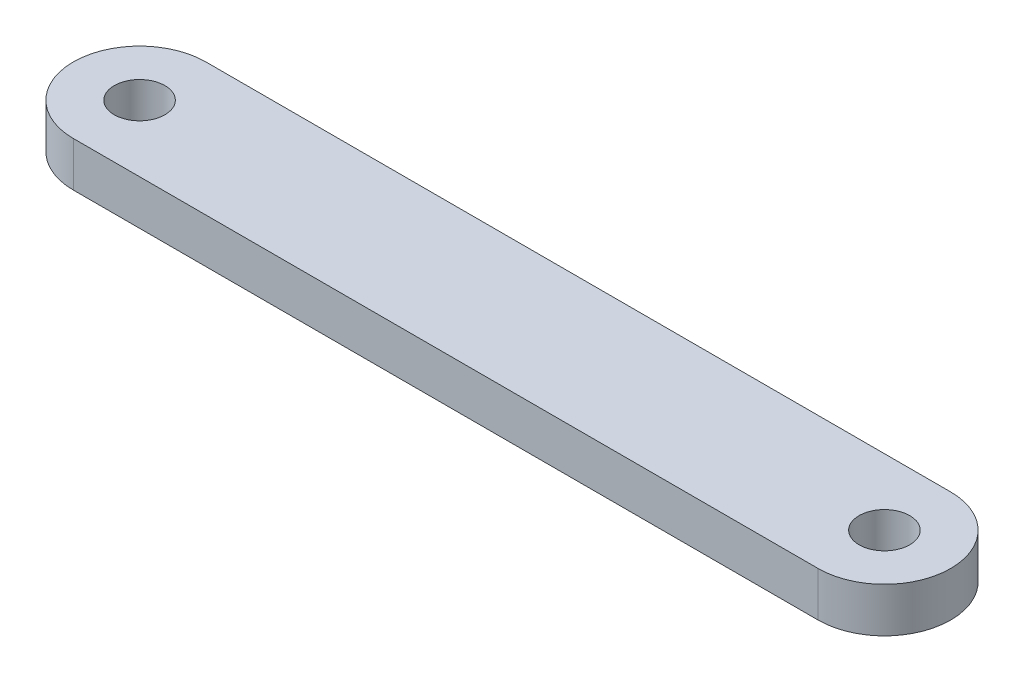
ISO-10303-21;
HEADER;
FILE_DESCRIPTION(('STEP AP214'),'2;1');
FILE_NAME('part.step','',(''),(''),'','','');
FILE_SCHEMA(('AUTOMOTIVE_DESIGN { 1 0 10303 214 1 1 1 1 }'));
ENDSEC;
DATA;
#1=APPLICATION_CONTEXT('core data for automotive mechanical design processes');
#2=APPLICATION_PROTOCOL_DEFINITION('international standard','automotive_design',2000,#1);
#3=PRODUCT_CONTEXT('',#1,'mechanical');
#4=PRODUCT('Part','Part','',(#3));
#5=PRODUCT_RELATED_PRODUCT_CATEGORY('part','',(#4));
#6=PRODUCT_DEFINITION_FORMATION('','',#4);
#7=PRODUCT_DEFINITION_CONTEXT('part definition',#1,'design');
#8=PRODUCT_DEFINITION('design','',#6,#7);
#9=PRODUCT_DEFINITION_SHAPE('','',#8);
#10=(LENGTH_UNIT() NAMED_UNIT(*) SI_UNIT(.MILLI.,.METRE.));
#11=(NAMED_UNIT(*) PLANE_ANGLE_UNIT() SI_UNIT($,.RADIAN.));
#12=(NAMED_UNIT(*) SI_UNIT($,.STERADIAN.) SOLID_ANGLE_UNIT());
#13=UNCERTAINTY_MEASURE_WITH_UNIT(LENGTH_MEASURE(1.E-05),#10,'distance_accuracy_value','');
#14=(GEOMETRIC_REPRESENTATION_CONTEXT(3) GLOBAL_UNCERTAINTY_ASSIGNED_CONTEXT((#13)) GLOBAL_UNIT_ASSIGNED_CONTEXT((#10,
#11,#12)) REPRESENTATION_CONTEXT('',''));
#15=CARTESIAN_POINT('',(0.,0.,0.));
#16=DIRECTION('',(0.,0.,1.));
#17=DIRECTION('',(1.,0.,0.));
#18=AXIS2_PLACEMENT_3D('',#15,#16,#17);
#19=CARTESIAN_POINT('',(0.,3.,4.45));
#20=DIRECTION('',(0.,0.,-1.));
#21=DIRECTION('',(-1.,0.,0.));
#22=AXIS2_PLACEMENT_3D('',#19,#20,#21);
#23=PLANE('',#22);
#24=DIRECTION('',(1.,0.,0.));
#25=VECTOR('',#24,1.);
#26=CARTESIAN_POINT('',(0.,0.,4.45));
#27=LINE('',#26,#25);
#28=CARTESIAN_POINT('',(0.,0.,4.45));
#29=VERTEX_POINT('',#28);
#30=CARTESIAN_POINT('',(50.,0.,4.45));
#31=VERTEX_POINT('',#30);
#32=EDGE_CURVE('E112',#29,#31,#27,.T.);
#33=ORIENTED_EDGE('',*,*,#32,.T.);
#34=DIRECTION('',(0.,-1.,0.));
#35=VECTOR('',#34,1.);
#36=CARTESIAN_POINT('',(50.,3.,4.45));
#37=LINE('',#36,#35);
#38=CARTESIAN_POINT('',(50.,3.,4.45));
#39=VERTEX_POINT('',#38);
#40=EDGE_CURVE('E11',#39,#31,#37,.T.);
#41=ORIENTED_EDGE('',*,*,#40,.F.);
#42=DIRECTION('',(1.,0.,0.));
#43=VECTOR('',#42,1.);
#44=CARTESIAN_POINT('',(0.,3.,4.45));
#45=LINE('',#44,#43);
#46=CARTESIAN_POINT('',(0.,3.,4.45));
#47=VERTEX_POINT('',#46);
#48=EDGE_CURVE('E93',#47,#39,#45,.T.);
#49=ORIENTED_EDGE('',*,*,#48,.F.);
#50=DIRECTION('',(0.,-1.,0.));
#51=VECTOR('',#50,1.);
#52=CARTESIAN_POINT('',(0.,3.,4.45));
#53=LINE('',#52,#51);
#54=EDGE_CURVE('E108',#47,#29,#53,.T.);
#55=ORIENTED_EDGE('',*,*,#54,.T.);
#56=EDGE_LOOP('',(#33,#41,#49,#55));
#57=FACE_BOUND('',#56,.T.);
#58=ADVANCED_FACE('F45',(#57),#23,.F.);
#59=CARTESIAN_POINT('',(50.,3.,0.));
#60=DIRECTION('',(0.,-1.,0.));
#61=DIRECTION('',(0.,0.,-1.));
#62=AXIS2_PLACEMENT_3D('',#59,#60,#61);
#63=CYLINDRICAL_SURFACE('',#62,4.45);
#64=CARTESIAN_POINT('',(50.,0.,0.));
#65=DIRECTION('',(0.,1.,0.));
#66=DIRECTION('',(0.,0.,1.));
#67=AXIS2_PLACEMENT_3D('',#64,#65,#66);
#68=CIRCLE('',#67,4.45);
#69=CARTESIAN_POINT('',(50.,0.,-4.45));
#70=VERTEX_POINT('',#69);
#71=EDGE_CURVE('E99',#31,#70,#68,.T.);
#72=ORIENTED_EDGE('',*,*,#71,.T.);
#73=DIRECTION('',(0.,-1.,0.));
#74=VECTOR('',#73,1.);
#75=CARTESIAN_POINT('',(50.,3.,-4.45));
#76=LINE('',#75,#74);
#77=CARTESIAN_POINT('',(50.,3.,-4.45));
#78=VERTEX_POINT('',#77);
#79=EDGE_CURVE('E54',#78,#70,#76,.T.);
#80=ORIENTED_EDGE('',*,*,#79,.F.);
#81=CARTESIAN_POINT('',(50.,3.,0.));
#82=DIRECTION('',(0.,1.,0.));
#83=DIRECTION('',(0.,0.,1.));
#84=AXIS2_PLACEMENT_3D('',#81,#82,#83);
#85=CIRCLE('',#84,4.45);
#86=EDGE_CURVE('E88',#39,#78,#85,.T.);
#87=ORIENTED_EDGE('',*,*,#86,.F.);
#88=ORIENTED_EDGE('',*,*,#40,.T.);
#89=EDGE_LOOP('',(#72,#80,#87,#88));
#90=FACE_BOUND('',#89,.T.);
#91=ADVANCED_FACE('F98',(#90),#63,.T.);
#92=CARTESIAN_POINT('',(0.,3.,-4.45));
#93=DIRECTION('',(0.,0.,-1.));
#94=DIRECTION('',(-1.,0.,0.));
#95=AXIS2_PLACEMENT_3D('',#92,#93,#94);
#96=PLANE('',#95);
#97=DIRECTION('',(1.,0.,0.));
#98=VECTOR('',#97,1.);
#99=CARTESIAN_POINT('',(0.,0.,-4.45));
#100=LINE('',#99,#98);
#101=CARTESIAN_POINT('',(0.,0.,-4.45));
#102=VERTEX_POINT('',#101);
#103=EDGE_CURVE('E119',#102,#70,#100,.T.);
#104=ORIENTED_EDGE('',*,*,#103,.F.);
#105=DIRECTION('',(0.,-1.,0.));
#106=VECTOR('',#105,1.);
#107=CARTESIAN_POINT('',(0.,3.,-4.45));
#108=LINE('',#107,#106);
#109=CARTESIAN_POINT('',(0.,3.,-4.45));
#110=VERTEX_POINT('',#109);
#111=EDGE_CURVE('E78',#110,#102,#108,.T.);
#112=ORIENTED_EDGE('',*,*,#111,.F.);
#113=DIRECTION('',(1.,0.,0.));
#114=VECTOR('',#113,1.);
#115=CARTESIAN_POINT('',(0.,3.,-4.45));
#116=LINE('',#115,#114);
#117=EDGE_CURVE('E91',#110,#78,#116,.T.);
#118=ORIENTED_EDGE('',*,*,#117,.T.);
#119=ORIENTED_EDGE('',*,*,#79,.T.);
#120=EDGE_LOOP('',(#104,#112,#118,#119));
#121=FACE_BOUND('',#120,.T.);
#122=ADVANCED_FACE('F104',(#121),#96,.T.);
#123=CARTESIAN_POINT('',(0.,3.,0.));
#124=DIRECTION('',(0.,-1.,0.));
#125=DIRECTION('',(0.,0.,-1.));
#126=AXIS2_PLACEMENT_3D('',#123,#124,#125);
#127=CYLINDRICAL_SURFACE('',#126,4.45);
#128=CARTESIAN_POINT('',(0.,0.,0.));
#129=DIRECTION('',(0.,1.,0.));
#130=DIRECTION('',(0.,0.,1.));
#131=AXIS2_PLACEMENT_3D('',#128,#129,#130);
#132=CIRCLE('',#131,4.45);
#133=EDGE_CURVE('E81',#102,#29,#132,.T.);
#134=ORIENTED_EDGE('',*,*,#133,.T.);
#135=ORIENTED_EDGE('',*,*,#54,.F.);
#136=CARTESIAN_POINT('',(0.,3.,0.));
#137=DIRECTION('',(0.,1.,0.));
#138=DIRECTION('',(0.,0.,1.));
#139=AXIS2_PLACEMENT_3D('',#136,#137,#138);
#140=CIRCLE('',#139,4.45);
#141=EDGE_CURVE('E62',#110,#47,#140,.T.);
#142=ORIENTED_EDGE('',*,*,#141,.F.);
#143=ORIENTED_EDGE('',*,*,#111,.T.);
#144=EDGE_LOOP('',(#134,#135,#142,#143));
#145=FACE_BOUND('',#144,.T.);
#146=ADVANCED_FACE('F142',(#145),#127,.T.);
#147=CARTESIAN_POINT('',(0.,3.,0.));
#148=DIRECTION('',(0.,1.,0.));
#149=DIRECTION('',(0.,0.,1.));
#150=AXIS2_PLACEMENT_3D('',#147,#148,#149);
#151=PLANE('',#150);
#152=CARTESIAN_POINT('',(0.,3.,0.));
#153=DIRECTION('',(0.,1.,0.));
#154=DIRECTION('',(0.,0.,1.));
#155=AXIS2_PLACEMENT_3D('',#152,#153,#154);
#156=CIRCLE('',#155,1.7);
#157=CARTESIAN_POINT('',(0.,3.,1.7));
#158=VERTEX_POINT('',#157);
#159=EDGE_CURVE('E240',#158,#158,#156,.T.);
#160=ORIENTED_EDGE('',*,*,#159,.F.);
#161=EDGE_LOOP('',(#160));
#162=FACE_BOUND('',#161,.T.);
#163=CARTESIAN_POINT('',(50.,3.,0.));
#164=DIRECTION('',(0.,1.,0.));
#165=DIRECTION('',(0.,0.,1.));
#166=AXIS2_PLACEMENT_3D('',#163,#164,#165);
#167=CIRCLE('',#166,1.7);
#168=CARTESIAN_POINT('',(50.,3.,1.7));
#169=VERTEX_POINT('',#168);
#170=EDGE_CURVE('E242',#169,#169,#167,.T.);
#171=ORIENTED_EDGE('',*,*,#170,.F.);
#172=EDGE_LOOP('',(#171));
#173=FACE_BOUND('',#172,.T.);
#174=ORIENTED_EDGE('',*,*,#48,.T.);
#175=ORIENTED_EDGE('',*,*,#86,.T.);
#176=ORIENTED_EDGE('',*,*,#117,.F.);
#177=ORIENTED_EDGE('',*,*,#141,.T.);
#178=EDGE_LOOP('',(#174,#175,#176,#177));
#179=FACE_BOUND('',#178,.T.);
#180=ADVANCED_FACE('F89',(#162,#173,#179),#151,.T.);
#181=CARTESIAN_POINT('',(0.,0.,0.));
#182=DIRECTION('',(0.,1.,0.));
#183=DIRECTION('',(0.,0.,1.));
#184=AXIS2_PLACEMENT_3D('',#181,#182,#183);
#185=PLANE('',#184);
#186=CARTESIAN_POINT('',(0.,0.,0.));
#187=DIRECTION('',(0.,1.,0.));
#188=DIRECTION('',(0.,0.,1.));
#189=AXIS2_PLACEMENT_3D('',#186,#187,#188);
#190=CIRCLE('',#189,1.7);
#191=CARTESIAN_POINT('',(0.,0.,1.7));
#192=VERTEX_POINT('',#191);
#193=EDGE_CURVE('E116',#192,#192,#190,.T.);
#194=ORIENTED_EDGE('',*,*,#193,.T.);
#195=EDGE_LOOP('',(#194));
#196=FACE_BOUND('',#195,.T.);
#197=CARTESIAN_POINT('',(50.,0.,0.));
#198=DIRECTION('',(0.,1.,0.));
#199=DIRECTION('',(0.,0.,1.));
#200=AXIS2_PLACEMENT_3D('',#197,#198,#199);
#201=CIRCLE('',#200,1.7);
#202=CARTESIAN_POINT('',(50.,0.,1.7));
#203=VERTEX_POINT('',#202);
#204=EDGE_CURVE('E248',#203,#203,#201,.T.);
#205=ORIENTED_EDGE('',*,*,#204,.T.);
#206=EDGE_LOOP('',(#205));
#207=FACE_BOUND('',#206,.T.);
#208=ORIENTED_EDGE('',*,*,#32,.F.);
#209=ORIENTED_EDGE('',*,*,#133,.F.);
#210=ORIENTED_EDGE('',*,*,#103,.T.);
#211=ORIENTED_EDGE('',*,*,#71,.F.);
#212=EDGE_LOOP('',(#208,#209,#210,#211));
#213=FACE_BOUND('',#212,.T.);
#214=ADVANCED_FACE('F130',(#196,#207,#213),#185,.F.);
#215=CARTESIAN_POINT('',(50.,0.,0.));
#216=DIRECTION('',(0.,1.,0.));
#217=DIRECTION('',(0.,0.,1.));
#218=AXIS2_PLACEMENT_3D('',#215,#216,#217);
#219=CYLINDRICAL_SURFACE('',#218,1.7);
#220=ORIENTED_EDGE('',*,*,#204,.F.);
#221=EDGE_LOOP('',(#220));
#222=FACE_BOUND('',#221,.T.);
#223=ORIENTED_EDGE('',*,*,#170,.T.);
#224=EDGE_LOOP('',(#223));
#225=FACE_BOUND('',#224,.T.);
#226=ADVANCED_FACE('F132',(#222,#225),#219,.F.);
#227=CARTESIAN_POINT('',(0.,0.,0.));
#228=DIRECTION('',(0.,1.,0.));
#229=DIRECTION('',(0.,0.,1.));
#230=AXIS2_PLACEMENT_3D('',#227,#228,#229);
#231=CYLINDRICAL_SURFACE('',#230,1.7);
#232=ORIENTED_EDGE('',*,*,#193,.F.);
#233=EDGE_LOOP('',(#232));
#234=FACE_BOUND('',#233,.T.);
#235=ORIENTED_EDGE('',*,*,#159,.T.);
#236=EDGE_LOOP('',(#235));
#237=FACE_BOUND('',#236,.T.);
#238=ADVANCED_FACE('F139',(#234,#237),#231,.F.);
#239=CLOSED_SHELL('',(#58,#91,#122,#146,#180,#214,#226,#238));
#240=MANIFOLD_SOLID_BREP('B2',#239);
#241=ADVANCED_BREP_SHAPE_REPRESENTATION('',(#18,#240),#14);
#242=SHAPE_DEFINITION_REPRESENTATION(#9,#241);
ENDSEC;
END-ISO-10303-21;
